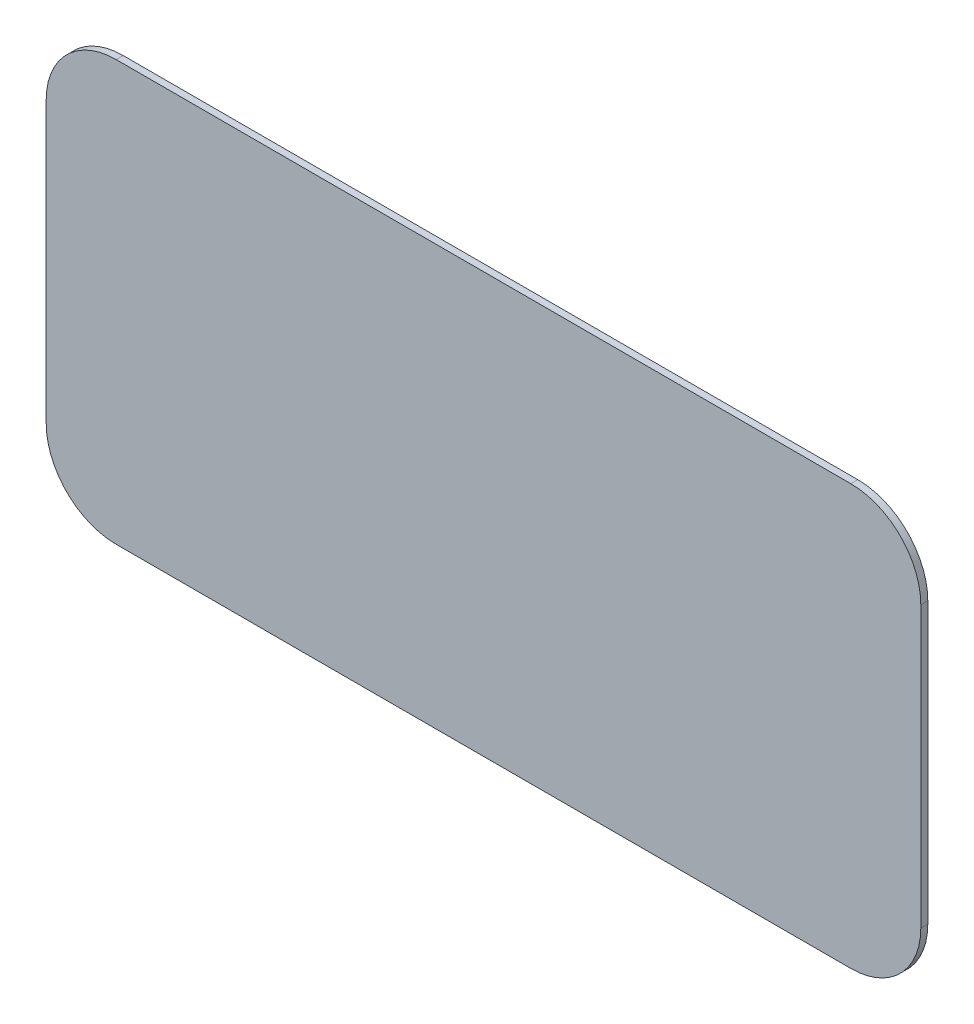
ISO-10303-21;
HEADER;
FILE_DESCRIPTION(('STEP AP214'),'2;1');
FILE_NAME('part.step','',(''),(''),'','','');
FILE_SCHEMA(('AUTOMOTIVE_DESIGN { 1 0 10303 214 1 1 1 1 }'));
ENDSEC;
DATA;
#1=APPLICATION_CONTEXT('core data for automotive mechanical design processes');
#2=APPLICATION_PROTOCOL_DEFINITION('international standard','automotive_design',2000,#1);
#3=PRODUCT_CONTEXT('',#1,'mechanical');
#4=PRODUCT('Part','Part','',(#3));
#5=PRODUCT_RELATED_PRODUCT_CATEGORY('part','',(#4));
#6=PRODUCT_DEFINITION_FORMATION('','',#4);
#7=PRODUCT_DEFINITION_CONTEXT('part definition',#1,'design');
#8=PRODUCT_DEFINITION('design','',#6,#7);
#9=PRODUCT_DEFINITION_SHAPE('','',#8);
#10=(LENGTH_UNIT() NAMED_UNIT(*) SI_UNIT(.MILLI.,.METRE.));
#11=(NAMED_UNIT(*) PLANE_ANGLE_UNIT() SI_UNIT($,.RADIAN.));
#12=(NAMED_UNIT(*) SI_UNIT($,.STERADIAN.) SOLID_ANGLE_UNIT());
#13=UNCERTAINTY_MEASURE_WITH_UNIT(LENGTH_MEASURE(1.E-05),#10,'distance_accuracy_value','');
#14=(GEOMETRIC_REPRESENTATION_CONTEXT(3) GLOBAL_UNCERTAINTY_ASSIGNED_CONTEXT((#13)) GLOBAL_UNIT_ASSIGNED_CONTEXT((#10,
#11,#12)) REPRESENTATION_CONTEXT('',''));
#15=CARTESIAN_POINT('',(0.,0.,0.));
#16=DIRECTION('',(0.,0.,1.));
#17=DIRECTION('',(1.,0.,0.));
#18=AXIS2_PLACEMENT_3D('',#15,#16,#17);
#19=CARTESIAN_POINT('',(-0.848822836926277,0.338176795580116,0.2));
#20=DIRECTION('',(0.,0.,-1.));
#21=DIRECTION('',(-1.,0.,0.));
#22=AXIS2_PLACEMENT_3D('',#19,#20,#21);
#23=CYLINDRICAL_SURFACE('',#22,2.);
#24=CARTESIAN_POINT('',(-0.848822836926277,0.338176795580116,0.));
#25=DIRECTION('',(0.,0.,1.));
#26=DIRECTION('',(-1.,0.,0.));
#27=AXIS2_PLACEMENT_3D('',#24,#25,#26);
#28=CIRCLE('',#27,2.);
#29=CARTESIAN_POINT('',(1.15117716307372,0.338176795580117,0.));
#30=VERTEX_POINT('',#29);
#31=CARTESIAN_POINT('',(-0.848822836926277,2.33817679558012,0.));
#32=VERTEX_POINT('',#31);
#33=EDGE_CURVE('E130',#30,#32,#28,.T.);
#34=ORIENTED_EDGE('',*,*,#33,.T.);
#35=DIRECTION('',(0.,0.,-1.));
#36=VECTOR('',#35,1.);
#37=CARTESIAN_POINT('',(-0.848822836926277,2.33817679558012,0.2));
#38=LINE('',#37,#36);
#39=CARTESIAN_POINT('',(-0.848822836926277,2.33817679558012,0.2));
#40=VERTEX_POINT('',#39);
#41=EDGE_CURVE('E11',#40,#32,#38,.T.);
#42=ORIENTED_EDGE('',*,*,#41,.F.);
#43=CARTESIAN_POINT('',(-0.848822836926277,0.338176795580116,0.2));
#44=DIRECTION('',(0.,0.,1.));
#45=DIRECTION('',(-1.,0.,0.));
#46=AXIS2_PLACEMENT_3D('',#43,#44,#45);
#47=CIRCLE('',#46,2.);
#48=CARTESIAN_POINT('',(1.15117716307372,0.338176795580117,0.2));
#49=VERTEX_POINT('',#48);
#50=EDGE_CURVE('E144',#49,#40,#47,.T.);
#51=ORIENTED_EDGE('',*,*,#50,.F.);
#52=DIRECTION('',(0.,0.,-1.));
#53=VECTOR('',#52,1.);
#54=CARTESIAN_POINT('',(1.15117716307372,0.338176795580117,0.2));
#55=LINE('',#54,#53);
#56=EDGE_CURVE('E126',#49,#30,#55,.T.);
#57=ORIENTED_EDGE('',*,*,#56,.T.);
#58=EDGE_LOOP('',(#34,#42,#51,#57));
#59=FACE_BOUND('',#58,.T.);
#60=ADVANCED_FACE('F34',(#59),#23,.T.);
#61=CARTESIAN_POINT('',(-21.8488228369263,2.33817679558012,0.2));
#62=DIRECTION('',(0.,-1.,0.));
#63=DIRECTION('',(0.,0.,-1.));
#64=AXIS2_PLACEMENT_3D('',#61,#62,#63);
#65=PLANE('',#64);
#66=DIRECTION('',(-1.,0.,0.));
#67=VECTOR('',#66,1.);
#68=CARTESIAN_POINT('',(-21.8488228369263,2.33817679558012,0.));
#69=LINE('',#68,#67);
#70=CARTESIAN_POINT('',(-21.8488228369263,2.33817679558012,0.));
#71=VERTEX_POINT('',#70);
#72=EDGE_CURVE('E133',#32,#71,#69,.T.);
#73=ORIENTED_EDGE('',*,*,#72,.T.);
#74=DIRECTION('',(0.,0.,-1.));
#75=VECTOR('',#74,1.);
#76=CARTESIAN_POINT('',(-21.8488228369263,2.33817679558012,0.2));
#77=LINE('',#76,#75);
#78=CARTESIAN_POINT('',(-21.8488228369263,2.33817679558012,0.2));
#79=VERTEX_POINT('',#78);
#80=EDGE_CURVE('E42',#79,#71,#77,.T.);
#81=ORIENTED_EDGE('',*,*,#80,.F.);
#82=DIRECTION('',(-1.,0.,0.));
#83=VECTOR('',#82,1.);
#84=CARTESIAN_POINT('',(-21.8488228369263,2.33817679558012,0.2));
#85=LINE('',#84,#83);
#86=EDGE_CURVE('E93',#40,#79,#85,.T.);
#87=ORIENTED_EDGE('',*,*,#86,.F.);
#88=ORIENTED_EDGE('',*,*,#41,.T.);
#89=EDGE_LOOP('',(#73,#81,#87,#88));
#90=FACE_BOUND('',#89,.T.);
#91=ADVANCED_FACE('F179',(#90),#65,.F.);
#92=CARTESIAN_POINT('',(-21.8488228369263,0.338176795580116,0.2));
#93=DIRECTION('',(0.,0.,-1.));
#94=DIRECTION('',(-1.,0.,0.));
#95=AXIS2_PLACEMENT_3D('',#92,#93,#94);
#96=CYLINDRICAL_SURFACE('',#95,2.);
#97=CARTESIAN_POINT('',(-21.8488228369263,0.338176795580116,0.));
#98=DIRECTION('',(0.,0.,1.));
#99=DIRECTION('',(-1.,0.,0.));
#100=AXIS2_PLACEMENT_3D('',#97,#98,#99);
#101=CIRCLE('',#100,2.);
#102=CARTESIAN_POINT('',(-23.8488228369263,0.338176795580116,0.));
#103=VERTEX_POINT('',#102);
#104=EDGE_CURVE('E135',#71,#103,#101,.T.);
#105=ORIENTED_EDGE('',*,*,#104,.T.);
#106=DIRECTION('',(0.,0.,-1.));
#107=VECTOR('',#106,1.);
#108=CARTESIAN_POINT('',(-23.8488228369263,0.338176795580116,0.2));
#109=LINE('',#108,#107);
#110=CARTESIAN_POINT('',(-23.8488228369263,0.338176795580116,0.2));
#111=VERTEX_POINT('',#110);
#112=EDGE_CURVE('E151',#111,#103,#109,.T.);
#113=ORIENTED_EDGE('',*,*,#112,.F.);
#114=CARTESIAN_POINT('',(-21.8488228369263,0.338176795580116,0.2));
#115=DIRECTION('',(0.,0.,1.));
#116=DIRECTION('',(-1.,0.,0.));
#117=AXIS2_PLACEMENT_3D('',#114,#115,#116);
#118=CIRCLE('',#117,2.);
#119=EDGE_CURVE('E159',#79,#111,#118,.T.);
#120=ORIENTED_EDGE('',*,*,#119,.F.);
#121=ORIENTED_EDGE('',*,*,#80,.T.);
#122=EDGE_LOOP('',(#105,#113,#120,#121));
#123=FACE_BOUND('',#122,.T.);
#124=ADVANCED_FACE('F157',(#123),#96,.T.);
#125=CARTESIAN_POINT('',(-23.8488228369263,0.338176795580116,0.2));
#126=DIRECTION('',(1.,0.,0.));
#127=DIRECTION('',(0.,1.,0.));
#128=AXIS2_PLACEMENT_3D('',#125,#126,#127);
#129=PLANE('',#128);
#130=DIRECTION('',(0.,-1.,0.));
#131=VECTOR('',#130,1.);
#132=CARTESIAN_POINT('',(-23.8488228369263,0.338176795580116,0.));
#133=LINE('',#132,#131);
#134=CARTESIAN_POINT('',(-23.8488228369263,-7.66182320441987,0.));
#135=VERTEX_POINT('',#134);
#136=EDGE_CURVE('E137',#103,#135,#133,.T.);
#137=ORIENTED_EDGE('',*,*,#136,.T.);
#138=DIRECTION('',(0.,0.,-1.));
#139=VECTOR('',#138,1.);
#140=CARTESIAN_POINT('',(-23.8488228369263,-7.66182320441987,0.2));
#141=LINE('',#140,#139);
#142=CARTESIAN_POINT('',(-23.8488228369263,-7.66182320441987,0.2));
#143=VERTEX_POINT('',#142);
#144=EDGE_CURVE('E148',#143,#135,#141,.T.);
#145=ORIENTED_EDGE('',*,*,#144,.F.);
#146=DIRECTION('',(0.,-1.,0.));
#147=VECTOR('',#146,1.);
#148=CARTESIAN_POINT('',(-23.8488228369263,0.338176795580116,0.2));
#149=LINE('',#148,#147);
#150=EDGE_CURVE('E171',#111,#143,#149,.T.);
#151=ORIENTED_EDGE('',*,*,#150,.F.);
#152=ORIENTED_EDGE('',*,*,#112,.T.);
#153=EDGE_LOOP('',(#137,#145,#151,#152));
#154=FACE_BOUND('',#153,.T.);
#155=ADVANCED_FACE('F167',(#154),#129,.F.);
#156=CARTESIAN_POINT('',(-21.8488228369263,-7.66182320441988,0.2));
#157=DIRECTION('',(0.,0.,-1.));
#158=DIRECTION('',(-1.,0.,0.));
#159=AXIS2_PLACEMENT_3D('',#156,#157,#158);
#160=CYLINDRICAL_SURFACE('',#159,2.);
#161=CARTESIAN_POINT('',(-21.8488228369263,-7.66182320441988,0.));
#162=DIRECTION('',(0.,0.,1.));
#163=DIRECTION('',(-1.,0.,0.));
#164=AXIS2_PLACEMENT_3D('',#161,#162,#163);
#165=CIRCLE('',#164,2.);
#166=CARTESIAN_POINT('',(-21.8488228369263,-9.66182320441988,0.));
#167=VERTEX_POINT('',#166);
#168=EDGE_CURVE('E139',#135,#167,#165,.T.);
#169=ORIENTED_EDGE('',*,*,#168,.T.);
#170=DIRECTION('',(0.,0.,-1.));
#171=VECTOR('',#170,1.);
#172=CARTESIAN_POINT('',(-21.8488228369263,-9.66182320441988,0.2));
#173=LINE('',#172,#171);
#174=CARTESIAN_POINT('',(-21.8488228369263,-9.66182320441988,0.2));
#175=VERTEX_POINT('',#174);
#176=EDGE_CURVE('E121',#175,#167,#173,.T.);
#177=ORIENTED_EDGE('',*,*,#176,.F.);
#178=CARTESIAN_POINT('',(-21.8488228369263,-7.66182320441988,0.2));
#179=DIRECTION('',(0.,0.,1.));
#180=DIRECTION('',(-1.,0.,0.));
#181=AXIS2_PLACEMENT_3D('',#178,#179,#180);
#182=CIRCLE('',#181,2.);
#183=EDGE_CURVE('E112',#143,#175,#182,.T.);
#184=ORIENTED_EDGE('',*,*,#183,.F.);
#185=ORIENTED_EDGE('',*,*,#144,.T.);
#186=EDGE_LOOP('',(#169,#177,#184,#185));
#187=FACE_BOUND('',#186,.T.);
#188=ADVANCED_FACE('F170',(#187),#160,.T.);
#189=CARTESIAN_POINT('',(-21.8488228369263,-9.66182320441988,0.2));
#190=DIRECTION('',(0.,1.,0.));
#191=DIRECTION('',(-1.,0.,0.));
#192=AXIS2_PLACEMENT_3D('',#189,#190,#191);
#193=PLANE('',#192);
#194=DIRECTION('',(1.,0.,0.));
#195=VECTOR('',#194,1.);
#196=CARTESIAN_POINT('',(-21.8488228369263,-9.66182320441988,0.));
#197=LINE('',#196,#195);
#198=CARTESIAN_POINT('',(-0.848822836926277,-9.66182320441989,0.));
#199=VERTEX_POINT('',#198);
#200=EDGE_CURVE('E120',#167,#199,#197,.T.);
#201=ORIENTED_EDGE('',*,*,#200,.T.);
#202=DIRECTION('',(0.,0.,-1.));
#203=VECTOR('',#202,1.);
#204=CARTESIAN_POINT('',(-0.848822836926277,-9.66182320441989,0.2));
#205=LINE('',#204,#203);
#206=CARTESIAN_POINT('',(-0.848822836926277,-9.66182320441989,0.2));
#207=VERTEX_POINT('',#206);
#208=EDGE_CURVE('E117',#207,#199,#205,.T.);
#209=ORIENTED_EDGE('',*,*,#208,.F.);
#210=DIRECTION('',(1.,0.,0.));
#211=VECTOR('',#210,1.);
#212=CARTESIAN_POINT('',(-21.8488228369263,-9.66182320441988,0.2));
#213=LINE('',#212,#211);
#214=EDGE_CURVE('E106',#175,#207,#213,.T.);
#215=ORIENTED_EDGE('',*,*,#214,.F.);
#216=ORIENTED_EDGE('',*,*,#176,.T.);
#217=EDGE_LOOP('',(#201,#209,#215,#216));
#218=FACE_BOUND('',#217,.T.);
#219=ADVANCED_FACE('F118',(#218),#193,.F.);
#220=CARTESIAN_POINT('',(-0.848822836926277,-7.66182320441988,0.2));
#221=DIRECTION('',(0.,0.,-1.));
#222=DIRECTION('',(-1.,0.,0.));
#223=AXIS2_PLACEMENT_3D('',#220,#221,#222);
#224=CYLINDRICAL_SURFACE('',#223,2.00000000000001);
#225=CARTESIAN_POINT('',(-0.848822836926277,-7.66182320441988,0.));
#226=DIRECTION('',(0.,0.,1.));
#227=DIRECTION('',(-1.,0.,0.));
#228=AXIS2_PLACEMENT_3D('',#225,#226,#227);
#229=CIRCLE('',#228,2.00000000000001);
#230=CARTESIAN_POINT('',(1.15117716307373,-7.66182320441987,0.));
#231=VERTEX_POINT('',#230);
#232=EDGE_CURVE('E79',#199,#231,#229,.T.);
#233=ORIENTED_EDGE('',*,*,#232,.T.);
#234=DIRECTION('',(0.,0.,-1.));
#235=VECTOR('',#234,1.);
#236=CARTESIAN_POINT('',(1.15117716307373,-7.66182320441987,0.2));
#237=LINE('',#236,#235);
#238=CARTESIAN_POINT('',(1.15117716307373,-7.66182320441987,0.2));
#239=VERTEX_POINT('',#238);
#240=EDGE_CURVE('E122',#239,#231,#237,.T.);
#241=ORIENTED_EDGE('',*,*,#240,.F.);
#242=CARTESIAN_POINT('',(-0.848822836926277,-7.66182320441988,0.2));
#243=DIRECTION('',(0.,0.,1.));
#244=DIRECTION('',(-1.,0.,0.));
#245=AXIS2_PLACEMENT_3D('',#242,#243,#244);
#246=CIRCLE('',#245,2.00000000000001);
#247=EDGE_CURVE('E110',#207,#239,#246,.T.);
#248=ORIENTED_EDGE('',*,*,#247,.F.);
#249=ORIENTED_EDGE('',*,*,#208,.T.);
#250=EDGE_LOOP('',(#233,#241,#248,#249));
#251=FACE_BOUND('',#250,.T.);
#252=ADVANCED_FACE('F124',(#251),#224,.T.);
#253=CARTESIAN_POINT('',(1.15117716307372,0.338176795580117,0.2));
#254=DIRECTION('',(-1.,0.,0.));
#255=DIRECTION('',(0.,-1.,0.));
#256=AXIS2_PLACEMENT_3D('',#253,#254,#255);
#257=PLANE('',#256);
#258=DIRECTION('',(0.,1.,0.));
#259=VECTOR('',#258,1.);
#260=CARTESIAN_POINT('',(1.15117716307372,0.338176795580117,0.));
#261=LINE('',#260,#259);
#262=EDGE_CURVE('E85',#231,#30,#261,.T.);
#263=ORIENTED_EDGE('',*,*,#262,.T.);
#264=ORIENTED_EDGE('',*,*,#56,.F.);
#265=DIRECTION('',(0.,1.,0.));
#266=VECTOR('',#265,1.);
#267=CARTESIAN_POINT('',(1.15117716307372,0.338176795580117,0.2));
#268=LINE('',#267,#266);
#269=EDGE_CURVE('E50',#239,#49,#268,.T.);
#270=ORIENTED_EDGE('',*,*,#269,.F.);
#271=ORIENTED_EDGE('',*,*,#240,.T.);
#272=EDGE_LOOP('',(#263,#264,#270,#271));
#273=FACE_BOUND('',#272,.T.);
#274=ADVANCED_FACE('F195',(#273),#257,.F.);
#275=CARTESIAN_POINT('',(-0.848822836926277,0.338176795580116,0.2));
#276=DIRECTION('',(0.,0.,-1.));
#277=DIRECTION('',(-1.,0.,0.));
#278=AXIS2_PLACEMENT_3D('',#275,#276,#277);
#279=PLANE('',#278);
#280=ORIENTED_EDGE('',*,*,#50,.T.);
#281=ORIENTED_EDGE('',*,*,#86,.T.);
#282=ORIENTED_EDGE('',*,*,#119,.T.);
#283=ORIENTED_EDGE('',*,*,#150,.T.);
#284=ORIENTED_EDGE('',*,*,#183,.T.);
#285=ORIENTED_EDGE('',*,*,#214,.T.);
#286=ORIENTED_EDGE('',*,*,#247,.T.);
#287=ORIENTED_EDGE('',*,*,#269,.T.);
#288=EDGE_LOOP('',(#280,#281,#282,#283,#284,#285,#286,#287));
#289=FACE_BOUND('',#288,.T.);
#290=ADVANCED_FACE('F108',(#289),#279,.F.);
#291=CARTESIAN_POINT('',(-0.848822836926277,0.338176795580116,0.));
#292=DIRECTION('',(0.,0.,-1.));
#293=DIRECTION('',(-1.,0.,0.));
#294=AXIS2_PLACEMENT_3D('',#291,#292,#293);
#295=PLANE('',#294);
#296=ORIENTED_EDGE('',*,*,#33,.F.);
#297=ORIENTED_EDGE('',*,*,#262,.F.);
#298=ORIENTED_EDGE('',*,*,#232,.F.);
#299=ORIENTED_EDGE('',*,*,#200,.F.);
#300=ORIENTED_EDGE('',*,*,#168,.F.);
#301=ORIENTED_EDGE('',*,*,#136,.F.);
#302=ORIENTED_EDGE('',*,*,#104,.F.);
#303=ORIENTED_EDGE('',*,*,#72,.F.);
#304=EDGE_LOOP('',(#296,#297,#298,#299,#300,#301,#302,#303));
#305=FACE_BOUND('',#304,.T.);
#306=ADVANCED_FACE('F163',(#305),#295,.T.);
#307=CLOSED_SHELL('',(#60,#91,#124,#155,#188,#219,#252,#274,#290,#306));
#308=MANIFOLD_SOLID_BREP('B2',#307);
#309=ADVANCED_BREP_SHAPE_REPRESENTATION('',(#18,#308),#14);
#310=SHAPE_DEFINITION_REPRESENTATION(#9,#309);
ENDSEC;
END-ISO-10303-21;
